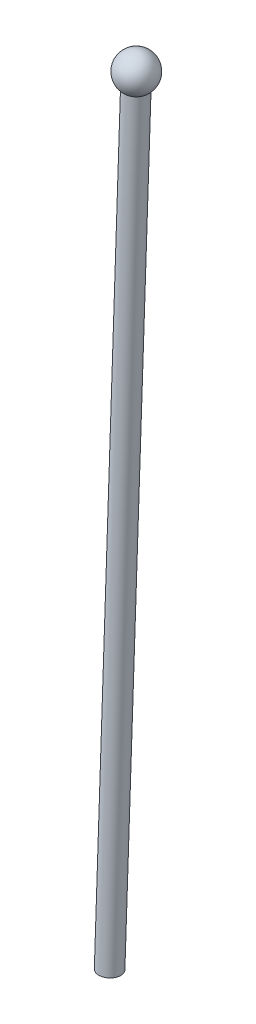
ISO-10303-21;
HEADER;
FILE_DESCRIPTION(('STEP AP214'),'2;1');
FILE_NAME('part.step','',(''),(''),'','','');
FILE_SCHEMA(('AUTOMOTIVE_DESIGN { 1 0 10303 214 1 1 1 1 }'));
ENDSEC;
DATA;
#1=APPLICATION_CONTEXT('core data for automotive mechanical design processes');
#2=APPLICATION_PROTOCOL_DEFINITION('international standard','automotive_design',2000,#1);
#3=PRODUCT_CONTEXT('',#1,'mechanical');
#4=PRODUCT('Part','Part','',(#3));
#5=PRODUCT_RELATED_PRODUCT_CATEGORY('part','',(#4));
#6=PRODUCT_DEFINITION_FORMATION('','',#4);
#7=PRODUCT_DEFINITION_CONTEXT('part definition',#1,'design');
#8=PRODUCT_DEFINITION('design','',#6,#7);
#9=PRODUCT_DEFINITION_SHAPE('','',#8);
#10=(LENGTH_UNIT() NAMED_UNIT(*) SI_UNIT(.MILLI.,.METRE.));
#11=(NAMED_UNIT(*) PLANE_ANGLE_UNIT() SI_UNIT($,.RADIAN.));
#12=(NAMED_UNIT(*) SI_UNIT($,.STERADIAN.) SOLID_ANGLE_UNIT());
#13=UNCERTAINTY_MEASURE_WITH_UNIT(LENGTH_MEASURE(1.E-05),#10,'distance_accuracy_value','');
#14=(GEOMETRIC_REPRESENTATION_CONTEXT(3) GLOBAL_UNCERTAINTY_ASSIGNED_CONTEXT((#13)) GLOBAL_UNIT_ASSIGNED_CONTEXT((#10,
#11,#12)) REPRESENTATION_CONTEXT('',''));
#15=CARTESIAN_POINT('',(0.,0.,0.));
#16=DIRECTION('',(0.,0.,1.));
#17=DIRECTION('',(1.,0.,0.));
#18=AXIS2_PLACEMENT_3D('',#15,#16,#17);
#19=CARTESIAN_POINT('',(-59.6561365597111,53.6813979454262,-1.87459572364703));
#20=DIRECTION('',(0.,0.999390827019096,-0.0348994967025013));
#21=DIRECTION('',(0.,0.0348994967025013,0.999390827019096));
#22=AXIS2_PLACEMENT_3D('',#19,#20,#21);
#23=PLANE('',#22);
#24=CARTESIAN_POINT('',(-59.6561365597111,49.8731838097816,-110.927580267543));
#25=DIRECTION('',(0.,0.999390827019096,-0.0348994967025013));
#26=DIRECTION('',(0.,0.0348994967025013,0.999390827019096));
#27=AXIS2_PLACEMENT_3D('',#24,#25,#26);
#28=CIRCLE('',#27,9.5249999999999);
#29=CARTESIAN_POINT('',(-59.6561365597111,50.2056015158729,-101.408382640187));
#30=VERTEX_POINT('',#29);
#31=EDGE_CURVE('E10',#30,#30,#28,.T.);
#32=ORIENTED_EDGE('',*,*,#31,.F.);
#33=EDGE_LOOP('',(#32));
#34=FACE_BOUND('',#33,.T.);
#35=ADVANCED_FACE('F39',(#34),#23,.F.);
#36=CARTESIAN_POINT('',(-59.656136559711,709.870885973192,-133.975207889875));
#37=DIRECTION('',(0.,0.999390827019096,-0.0348994967025013));
#38=DIRECTION('',(0.,0.0348994967025013,0.999390827019096));
#39=AXIS2_PLACEMENT_3D('',#36,#37,#38);
#40=CYLINDRICAL_SURFACE('',#39,9.52499999999993);
#41=ORIENTED_EDGE('',*,*,#31,.T.);
#42=EDGE_LOOP('',(#41));
#43=FACE_BOUND('',#42,.T.);
#44=CARTESIAN_POINT('',(-59.656136559711,709.870885973193,-133.975207889875));
#45=DIRECTION('',(0.,0.999390827019096,-0.0348994967025013));
#46=DIRECTION('',(0.,0.0348994967025013,0.999390827019096));
#47=AXIS2_PLACEMENT_3D('',#44,#45,#46);
#48=CIRCLE('',#47,9.52499999999996);
#49=CARTESIAN_POINT('',(-59.656136559711,710.203303679284,-124.456010262519));
#50=VERTEX_POINT('',#49);
#51=EDGE_CURVE('E44',#50,#50,#48,.T.);
#52=ORIENTED_EDGE('',*,*,#51,.F.);
#53=EDGE_LOOP('',(#52));
#54=FACE_BOUND('',#53,.T.);
#55=ADVANCED_FACE('F52',(#43,#54),#40,.T.);
#56=CARTESIAN_POINT('',(-59.656136559711,722.563149476335,-134.418431497997));
#57=DIRECTION('',(0.,0.999390827019096,-0.0348994967025013));
#58=DIRECTION('',(0.,-0.0348994967025013,-0.999390827019096));
#59=AXIS2_PLACEMENT_3D('',#56,#57,#58);
#60=SPHERICAL_SURFACE('',#59,15.8750000000001);
#61=ORIENTED_EDGE('',*,*,#51,.T.);
#62=EDGE_LOOP('',(#61));
#63=FACE_BOUND('',#62,.T.);
#64=ADVANCED_FACE('F51',(#63),#60,.T.);
#65=CLOSED_SHELL('',(#35,#55,#64));
#66=MANIFOLD_SOLID_BREP('B2',#65);
#67=ADVANCED_BREP_SHAPE_REPRESENTATION('',(#18,#66),#14);
#68=SHAPE_DEFINITION_REPRESENTATION(#9,#67);
ENDSEC;
END-ISO-10303-21;
